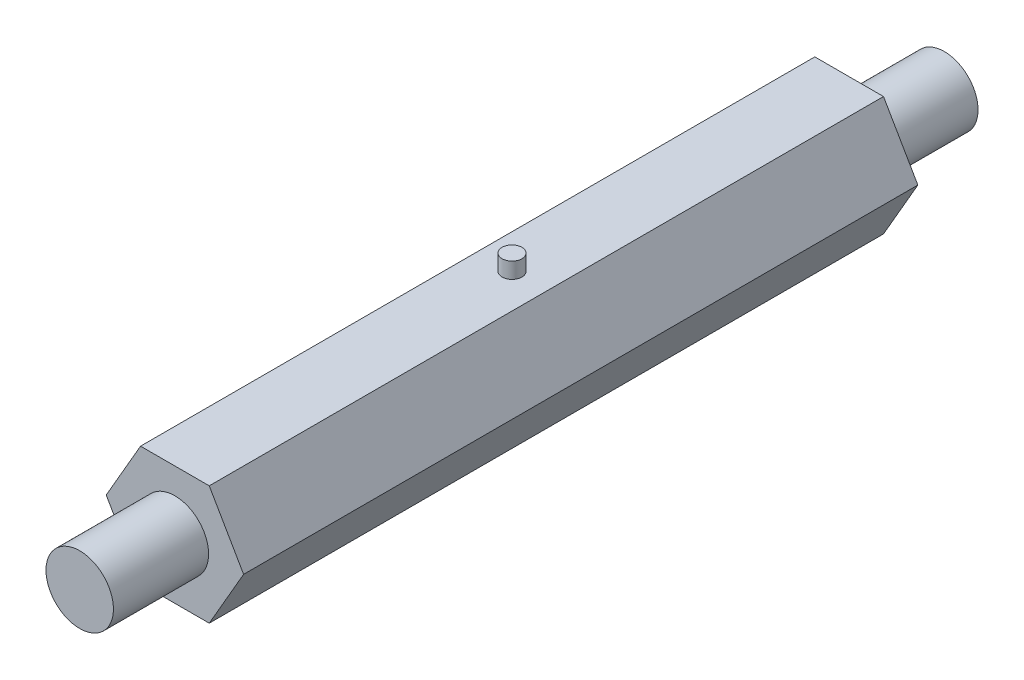
ISO-10303-21;
HEADER;
FILE_DESCRIPTION(('STEP AP214'),'2;1');
FILE_NAME('part.step','',(''),(''),'','','');
FILE_SCHEMA(('AUTOMOTIVE_DESIGN { 1 0 10303 214 1 1 1 1 }'));
ENDSEC;
DATA;
#1=APPLICATION_CONTEXT('core data for automotive mechanical design processes');
#2=APPLICATION_PROTOCOL_DEFINITION('international standard','automotive_design',2000,#1);
#3=PRODUCT_CONTEXT('',#1,'mechanical');
#4=PRODUCT('Part','Part','',(#3));
#5=PRODUCT_RELATED_PRODUCT_CATEGORY('part','',(#4));
#6=PRODUCT_DEFINITION_FORMATION('','',#4);
#7=PRODUCT_DEFINITION_CONTEXT('part definition',#1,'design');
#8=PRODUCT_DEFINITION('design','',#6,#7);
#9=PRODUCT_DEFINITION_SHAPE('','',#8);
#10=(LENGTH_UNIT() NAMED_UNIT(*) SI_UNIT(.MILLI.,.METRE.));
#11=(NAMED_UNIT(*) PLANE_ANGLE_UNIT() SI_UNIT($,.RADIAN.));
#12=(NAMED_UNIT(*) SI_UNIT($,.STERADIAN.) SOLID_ANGLE_UNIT());
#13=UNCERTAINTY_MEASURE_WITH_UNIT(LENGTH_MEASURE(1.E-05),#10,'distance_accuracy_value','');
#14=(GEOMETRIC_REPRESENTATION_CONTEXT(3) GLOBAL_UNCERTAINTY_ASSIGNED_CONTEXT((#13)) GLOBAL_UNIT_ASSIGNED_CONTEXT((#10,
#11,#12)) REPRESENTATION_CONTEXT('',''));
#15=CARTESIAN_POINT('',(0.,0.,0.));
#16=DIRECTION('',(0.,0.,1.));
#17=DIRECTION('',(1.,0.,0.));
#18=AXIS2_PLACEMENT_3D('',#15,#16,#17);
#19=CARTESIAN_POINT('',(10.9985226280624,0.,53.975));
#20=DIRECTION('',(-0.866025403784439,-0.5,0.));
#21=DIRECTION('',(0.5,-0.866025403784439,0.));
#22=AXIS2_PLACEMENT_3D('',#19,#20,#21);
#23=PLANE('',#22);
#24=DIRECTION('',(0.,0.,-1.));
#25=VECTOR('',#24,1.);
#26=CARTESIAN_POINT('',(10.9985226280624,0.,53.975));
#27=LINE('',#26,#25);
#28=CARTESIAN_POINT('',(10.9985226280624,0.,53.975));
#29=VERTEX_POINT('',#28);
#30=CARTESIAN_POINT('',(10.9985226280624,0.,-53.975));
#31=VERTEX_POINT('',#30);
#32=EDGE_CURVE('E114',#29,#31,#27,.T.);
#33=ORIENTED_EDGE('',*,*,#32,.T.);
#34=DIRECTION('',(-0.5,0.866025403784439,0.));
#35=VECTOR('',#34,1.);
#36=CARTESIAN_POINT('',(10.9985226280624,0.,-53.975));
#37=LINE('',#36,#35);
#38=CARTESIAN_POINT('',(5.49926131403118,9.525,-53.975));
#39=VERTEX_POINT('',#38);
#40=EDGE_CURVE('E108',#31,#39,#37,.T.);
#41=ORIENTED_EDGE('',*,*,#40,.T.);
#42=DIRECTION('',(0.,0.,-1.));
#43=VECTOR('',#42,1.);
#44=CARTESIAN_POINT('',(5.49926131403118,9.525,53.975));
#45=LINE('',#44,#43);
#46=CARTESIAN_POINT('',(5.49926131403118,9.525,53.975));
#47=VERTEX_POINT('',#46);
#48=EDGE_CURVE('E92',#47,#39,#45,.T.);
#49=ORIENTED_EDGE('',*,*,#48,.F.);
#50=DIRECTION('',(-0.5,0.866025403784439,0.));
#51=VECTOR('',#50,1.);
#52=CARTESIAN_POINT('',(10.9985226280624,0.,53.975));
#53=LINE('',#52,#51);
#54=EDGE_CURVE('E143',#29,#47,#53,.T.);
#55=ORIENTED_EDGE('',*,*,#54,.F.);
#56=EDGE_LOOP('',(#33,#41,#49,#55));
#57=FACE_BOUND('',#56,.T.);
#58=ADVANCED_FACE('F39',(#57),#23,.F.);
#59=CARTESIAN_POINT('',(5.49926131403118,9.525,53.975));
#60=DIRECTION('',(0.,-1.,0.));
#61=DIRECTION('',(0.,0.,-1.));
#62=AXIS2_PLACEMENT_3D('',#59,#60,#61);
#63=PLANE('',#62);
#64=CARTESIAN_POINT('',(0.,9.525,0.));
#65=DIRECTION('',(0.,-1.,0.));
#66=DIRECTION('',(0.,0.,-1.));
#67=AXIS2_PLACEMENT_3D('',#64,#65,#66);
#68=CIRCLE('',#67,1.5875);
#69=CARTESIAN_POINT('',(0.,9.525,-1.5875));
#70=VERTEX_POINT('',#69);
#71=EDGE_CURVE('E11',#70,#70,#68,.F.);
#72=ORIENTED_EDGE('',*,*,#71,.F.);
#73=EDGE_LOOP('',(#72));
#74=FACE_BOUND('',#73,.T.);
#75=ORIENTED_EDGE('',*,*,#48,.T.);
#76=DIRECTION('',(-1.,0.,0.));
#77=VECTOR('',#76,1.);
#78=CARTESIAN_POINT('',(5.49926131403118,9.525,-53.975));
#79=LINE('',#78,#77);
#80=CARTESIAN_POINT('',(-5.49926131403118,9.525,-53.975));
#81=VERTEX_POINT('',#80);
#82=EDGE_CURVE('E96',#39,#81,#79,.T.);
#83=ORIENTED_EDGE('',*,*,#82,.T.);
#84=DIRECTION('',(0.,0.,-1.));
#85=VECTOR('',#84,1.);
#86=CARTESIAN_POINT('',(-5.49926131403118,9.525,53.975));
#87=LINE('',#86,#85);
#88=CARTESIAN_POINT('',(-5.49926131403118,9.525,53.975));
#89=VERTEX_POINT('',#88);
#90=EDGE_CURVE('E102',#89,#81,#87,.T.);
#91=ORIENTED_EDGE('',*,*,#90,.F.);
#92=DIRECTION('',(-1.,0.,0.));
#93=VECTOR('',#92,1.);
#94=CARTESIAN_POINT('',(5.49926131403118,9.525,53.975));
#95=LINE('',#94,#93);
#96=EDGE_CURVE('E97',#47,#89,#95,.T.);
#97=ORIENTED_EDGE('',*,*,#96,.F.);
#98=EDGE_LOOP('',(#75,#83,#91,#97));
#99=FACE_BOUND('',#98,.T.);
#100=ADVANCED_FACE('F94',(#74,#99),#63,.F.);
#101=CARTESIAN_POINT('',(-5.49926131403118,9.525,53.975));
#102=DIRECTION('',(0.866025403784439,-0.5,0.));
#103=DIRECTION('',(0.5,0.866025403784439,0.));
#104=AXIS2_PLACEMENT_3D('',#101,#102,#103);
#105=PLANE('',#104);
#106=ORIENTED_EDGE('',*,*,#90,.T.);
#107=DIRECTION('',(-0.5,-0.866025403784439,0.));
#108=VECTOR('',#107,1.);
#109=CARTESIAN_POINT('',(-5.49926131403118,9.525,-53.975));
#110=LINE('',#109,#108);
#111=CARTESIAN_POINT('',(-10.9985226280624,0.,-53.975));
#112=VERTEX_POINT('',#111);
#113=EDGE_CURVE('E111',#81,#112,#110,.T.);
#114=ORIENTED_EDGE('',*,*,#113,.T.);
#115=DIRECTION('',(0.,0.,-1.));
#116=VECTOR('',#115,1.);
#117=CARTESIAN_POINT('',(-10.9985226280624,0.,53.975));
#118=LINE('',#117,#116);
#119=CARTESIAN_POINT('',(-10.9985226280624,0.,53.975));
#120=VERTEX_POINT('',#119);
#121=EDGE_CURVE('E169',#120,#112,#118,.T.);
#122=ORIENTED_EDGE('',*,*,#121,.F.);
#123=DIRECTION('',(-0.5,-0.866025403784439,0.));
#124=VECTOR('',#123,1.);
#125=CARTESIAN_POINT('',(-5.49926131403118,9.525,53.975));
#126=LINE('',#125,#124);
#127=EDGE_CURVE('E151',#89,#120,#126,.T.);
#128=ORIENTED_EDGE('',*,*,#127,.F.);
#129=EDGE_LOOP('',(#106,#114,#122,#128));
#130=FACE_BOUND('',#129,.T.);
#131=ADVANCED_FACE('F175',(#130),#105,.F.);
#132=CARTESIAN_POINT('',(-10.9985226280624,0.,53.975));
#133=DIRECTION('',(0.866025403784439,0.5,0.));
#134=DIRECTION('',(-0.5,0.866025403784439,0.));
#135=AXIS2_PLACEMENT_3D('',#132,#133,#134);
#136=PLANE('',#135);
#137=ORIENTED_EDGE('',*,*,#121,.T.);
#138=DIRECTION('',(0.5,-0.866025403784439,0.));
#139=VECTOR('',#138,1.);
#140=CARTESIAN_POINT('',(-10.9985226280624,0.,-53.975));
#141=LINE('',#140,#139);
#142=CARTESIAN_POINT('',(-5.49926131403119,-9.52499999999999,-53.975));
#143=VERTEX_POINT('',#142);
#144=EDGE_CURVE('E128',#112,#143,#141,.T.);
#145=ORIENTED_EDGE('',*,*,#144,.T.);
#146=DIRECTION('',(0.,0.,-1.));
#147=VECTOR('',#146,1.);
#148=CARTESIAN_POINT('',(-5.49926131403119,-9.52499999999999,53.975));
#149=LINE('',#148,#147);
#150=CARTESIAN_POINT('',(-5.49926131403119,-9.52499999999999,53.975));
#151=VERTEX_POINT('',#150);
#152=EDGE_CURVE('E166',#151,#143,#149,.T.);
#153=ORIENTED_EDGE('',*,*,#152,.F.);
#154=DIRECTION('',(0.5,-0.866025403784439,0.));
#155=VECTOR('',#154,1.);
#156=CARTESIAN_POINT('',(-10.9985226280624,0.,53.975));
#157=LINE('',#156,#155);
#158=EDGE_CURVE('E154',#120,#151,#157,.T.);
#159=ORIENTED_EDGE('',*,*,#158,.F.);
#160=EDGE_LOOP('',(#137,#145,#153,#159));
#161=FACE_BOUND('',#160,.T.);
#162=ADVANCED_FACE('F181',(#161),#136,.F.);
#163=CARTESIAN_POINT('',(-5.49926131403119,-9.52499999999999,53.975));
#164=DIRECTION('',(0.,1.,0.));
#165=DIRECTION('',(-1.,0.,0.));
#166=AXIS2_PLACEMENT_3D('',#163,#164,#165);
#167=PLANE('',#166);
#168=ORIENTED_EDGE('',*,*,#152,.T.);
#169=DIRECTION('',(1.,0.,0.));
#170=VECTOR('',#169,1.);
#171=CARTESIAN_POINT('',(-5.49926131403119,-9.52499999999999,-53.975));
#172=LINE('',#171,#170);
#173=CARTESIAN_POINT('',(5.49926131403118,-9.525,-53.975));
#174=VERTEX_POINT('',#173);
#175=EDGE_CURVE('E132',#143,#174,#172,.T.);
#176=ORIENTED_EDGE('',*,*,#175,.T.);
#177=DIRECTION('',(0.,0.,-1.));
#178=VECTOR('',#177,1.);
#179=CARTESIAN_POINT('',(5.49926131403118,-9.525,53.975));
#180=LINE('',#179,#178);
#181=CARTESIAN_POINT('',(5.49926131403118,-9.525,53.975));
#182=VERTEX_POINT('',#181);
#183=EDGE_CURVE('E163',#182,#174,#180,.T.);
#184=ORIENTED_EDGE('',*,*,#183,.F.);
#185=DIRECTION('',(1.,0.,0.));
#186=VECTOR('',#185,1.);
#187=CARTESIAN_POINT('',(-5.49926131403119,-9.52499999999999,53.975));
#188=LINE('',#187,#186);
#189=EDGE_CURVE('E59',#151,#182,#188,.T.);
#190=ORIENTED_EDGE('',*,*,#189,.F.);
#191=EDGE_LOOP('',(#168,#176,#184,#190));
#192=FACE_BOUND('',#191,.T.);
#193=ADVANCED_FACE('F184',(#192),#167,.F.);
#194=CARTESIAN_POINT('',(5.49926131403118,-9.525,53.975));
#195=DIRECTION('',(-0.866025403784438,0.5,0.));
#196=DIRECTION('',(-0.5,-0.866025403784438,0.));
#197=AXIS2_PLACEMENT_3D('',#194,#195,#196);
#198=PLANE('',#197);
#199=ORIENTED_EDGE('',*,*,#183,.T.);
#200=DIRECTION('',(0.5,0.866025403784438,0.));
#201=VECTOR('',#200,1.);
#202=CARTESIAN_POINT('',(5.49926131403118,-9.525,-53.975));
#203=LINE('',#202,#201);
#204=EDGE_CURVE('E136',#174,#31,#203,.T.);
#205=ORIENTED_EDGE('',*,*,#204,.T.);
#206=ORIENTED_EDGE('',*,*,#32,.F.);
#207=DIRECTION('',(0.5,0.866025403784438,0.));
#208=VECTOR('',#207,1.);
#209=CARTESIAN_POINT('',(5.49926131403118,-9.525,53.975));
#210=LINE('',#209,#208);
#211=EDGE_CURVE('E54',#182,#29,#210,.T.);
#212=ORIENTED_EDGE('',*,*,#211,.F.);
#213=EDGE_LOOP('',(#199,#205,#206,#212));
#214=FACE_BOUND('',#213,.T.);
#215=ADVANCED_FACE('F186',(#214),#198,.F.);
#216=CARTESIAN_POINT('',(0.,0.,53.975));
#217=DIRECTION('',(0.,0.,1.));
#218=DIRECTION('',(1.,0.,0.));
#219=AXIS2_PLACEMENT_3D('',#216,#217,#218);
#220=PLANE('',#219);
#221=CARTESIAN_POINT('',(0.,0.,53.975));
#222=DIRECTION('',(0.,0.,1.));
#223=DIRECTION('',(1.,0.,0.));
#224=AXIS2_PLACEMENT_3D('',#221,#222,#223);
#225=CIRCLE('',#224,5.3975);
#226=CARTESIAN_POINT('',(-5.3975,0.,53.975));
#227=VERTEX_POINT('',#226);
#228=EDGE_CURVE('E47',#227,#227,#225,.T.);
#229=ORIENTED_EDGE('',*,*,#228,.F.);
#230=EDGE_LOOP('',(#229));
#231=FACE_BOUND('',#230,.T.);
#232=ORIENTED_EDGE('',*,*,#54,.T.);
#233=ORIENTED_EDGE('',*,*,#96,.T.);
#234=ORIENTED_EDGE('',*,*,#127,.T.);
#235=ORIENTED_EDGE('',*,*,#158,.T.);
#236=ORIENTED_EDGE('',*,*,#189,.T.);
#237=ORIENTED_EDGE('',*,*,#211,.T.);
#238=EDGE_LOOP('',(#232,#233,#234,#235,#236,#237));
#239=FACE_BOUND('',#238,.T.);
#240=ADVANCED_FACE('F178',(#231,#239),#220,.T.);
#241=CARTESIAN_POINT('',(0.,0.,69.215));
#242=DIRECTION('',(0.,0.,-1.));
#243=DIRECTION('',(-1.,0.,0.));
#244=AXIS2_PLACEMENT_3D('',#241,#242,#243);
#245=CYLINDRICAL_SURFACE('',#244,5.3975);
#246=CARTESIAN_POINT('',(0.,0.,69.215));
#247=DIRECTION('',(0.,0.,1.));
#248=DIRECTION('',(1.,0.,0.));
#249=AXIS2_PLACEMENT_3D('',#246,#247,#248);
#250=CIRCLE('',#249,5.3975);
#251=CARTESIAN_POINT('',(-5.3975,0.,69.215));
#252=VERTEX_POINT('',#251);
#253=EDGE_CURVE('E139',#252,#252,#250,.T.);
#254=CARTESIAN_POINT('',(-5.3975,0.,69.215));
#255=CARTESIAN_POINT('',(-5.3975,0.,69.05625));
#256=CARTESIAN_POINT('',(-5.3975,0.,68.8975));
#257=CARTESIAN_POINT('',(-5.3975,0.,68.58));
#258=CARTESIAN_POINT('',(-5.3975,0.,68.42125));
#259=CARTESIAN_POINT('',(-5.3975,0.,68.10375));
#260=CARTESIAN_POINT('',(-5.3975,0.,67.945));
#261=CARTESIAN_POINT('',(-5.3975,0.,67.6275));
#262=CARTESIAN_POINT('',(-5.3975,0.,67.46875));
#263=CARTESIAN_POINT('',(-5.3975,0.,67.15125));
#264=CARTESIAN_POINT('',(-5.3975,0.,66.9925));
#265=CARTESIAN_POINT('',(-5.3975,0.,66.675));
#266=CARTESIAN_POINT('',(-5.3975,0.,66.51625));
#267=CARTESIAN_POINT('',(-5.3975,0.,66.19875));
#268=CARTESIAN_POINT('',(-5.3975,0.,66.04));
#269=CARTESIAN_POINT('',(-5.3975,0.,65.7225));
#270=CARTESIAN_POINT('',(-5.3975,0.,65.56375));
#271=CARTESIAN_POINT('',(-5.3975,0.,65.24625));
#272=CARTESIAN_POINT('',(-5.3975,0.,65.0875));
#273=CARTESIAN_POINT('',(-5.3975,0.,64.77));
#274=CARTESIAN_POINT('',(-5.3975,0.,64.61125));
#275=CARTESIAN_POINT('',(-5.3975,0.,64.29375));
#276=CARTESIAN_POINT('',(-5.3975,0.,64.135));
#277=CARTESIAN_POINT('',(-5.3975,0.,63.8175));
#278=CARTESIAN_POINT('',(-5.3975,0.,63.65875));
#279=CARTESIAN_POINT('',(-5.3975,0.,63.34125));
#280=CARTESIAN_POINT('',(-5.3975,0.,63.1825));
#281=CARTESIAN_POINT('',(-5.3975,0.,62.865));
#282=CARTESIAN_POINT('',(-5.3975,0.,62.70625));
#283=CARTESIAN_POINT('',(-5.3975,0.,62.38875));
#284=CARTESIAN_POINT('',(-5.3975,0.,62.23));
#285=CARTESIAN_POINT('',(-5.3975,0.,61.9125));
#286=CARTESIAN_POINT('',(-5.3975,0.,61.75375));
#287=CARTESIAN_POINT('',(-5.3975,0.,61.43625));
#288=CARTESIAN_POINT('',(-5.3975,0.,61.2775));
#289=CARTESIAN_POINT('',(-5.3975,0.,60.96));
#290=CARTESIAN_POINT('',(-5.3975,0.,60.80125));
#291=CARTESIAN_POINT('',(-5.3975,0.,60.48375));
#292=CARTESIAN_POINT('',(-5.3975,0.,60.325));
#293=CARTESIAN_POINT('',(-5.3975,0.,60.0075));
#294=CARTESIAN_POINT('',(-5.3975,0.,59.84875));
#295=CARTESIAN_POINT('',(-5.3975,0.,59.53125));
#296=CARTESIAN_POINT('',(-5.3975,0.,59.3725));
#297=CARTESIAN_POINT('',(-5.3975,0.,59.055));
#298=CARTESIAN_POINT('',(-5.3975,0.,58.89625));
#299=CARTESIAN_POINT('',(-5.3975,0.,58.57875));
#300=CARTESIAN_POINT('',(-5.3975,0.,58.42));
#301=CARTESIAN_POINT('',(-5.3975,0.,58.1025));
#302=CARTESIAN_POINT('',(-5.3975,0.,57.94375));
#303=CARTESIAN_POINT('',(-5.3975,0.,57.62625));
#304=CARTESIAN_POINT('',(-5.3975,0.,57.4675));
#305=CARTESIAN_POINT('',(-5.3975,0.,57.15));
#306=CARTESIAN_POINT('',(-5.3975,0.,56.99125));
#307=CARTESIAN_POINT('',(-5.3975,0.,56.67375));
#308=CARTESIAN_POINT('',(-5.3975,0.,56.515));
#309=CARTESIAN_POINT('',(-5.3975,0.,56.1975));
#310=CARTESIAN_POINT('',(-5.3975,0.,56.03875));
#311=CARTESIAN_POINT('',(-5.3975,0.,55.72125));
#312=CARTESIAN_POINT('',(-5.3975,0.,55.5625));
#313=CARTESIAN_POINT('',(-5.3975,0.,55.245));
#314=CARTESIAN_POINT('',(-5.3975,0.,55.08625));
#315=CARTESIAN_POINT('',(-5.3975,0.,54.76875));
#316=CARTESIAN_POINT('',(-5.3975,0.,54.61));
#317=CARTESIAN_POINT('',(-5.3975,0.,54.2925));
#318=CARTESIAN_POINT('',(-5.3975,0.,54.13375));
#319=CARTESIAN_POINT('',(-5.3975,0.,53.975));
#320=B_SPLINE_CURVE_WITH_KNOTS('',3,(#254,#255,#256,#257,#258,#259,#260,#261,#262,#263,#264,
#265,#266,#267,#268,#269,#270,#271,#272,#273,#274,#275,#276,#277,#278,#279,#280,#281,#282,#283,
#284,#285,#286,#287,#288,#289,#290,#291,#292,#293,#294,#295,#296,#297,#298,#299,#300,#301,#302,
#303,#304,#305,#306,#307,#308,#309,#310,#311,#312,#313,#314,#315,#316,#317,#318,#319),
.UNSPECIFIED.,.F.,.F.,(4,2,2,2,2,2,2,2,2,2,2,2,2,2,2,2,2,2,2,2,2,2,2,2,2,2,2,2,2,2,2,2,4),(0.,
0.476249999999998,0.952499999999995,1.42874999999999,1.90499999999999,2.38124999999999,2.8575,
3.33375,3.80999999999999,4.28624999999999,4.76249999999999,5.23875,5.715,6.19125,
6.66749999999999,7.14374999999999,7.61999999999999,8.09624999999999,8.5725,9.04874999999999,
9.52499999999999,10.00125,10.4775,10.95375,11.43,11.90625,12.3825,12.85875,13.335,13.81125,
14.2875,14.76375,15.24),.UNSPECIFIED.);
#321=EDGE_CURVE('BSEAM193',#252,#227,#320,.T.);
#322=ORIENTED_EDGE('',*,*,#253,.F.);
#323=ORIENTED_EDGE('',*,*,#228,.T.);
#324=ORIENTED_EDGE('',*,*,#321,.T.);
#325=ORIENTED_EDGE('',*,*,#321,.F.);
#326=EDGE_LOOP('',(#322,#324,#323,#325));
#327=FACE_BOUND('',#326,.T.);
#328=ADVANCED_FACE('F193',(#327),#245,.T.);
#329=CARTESIAN_POINT('',(0.,0.,69.215));
#330=DIRECTION('',(0.,0.,1.));
#331=DIRECTION('',(1.,0.,0.));
#332=AXIS2_PLACEMENT_3D('',#329,#330,#331);
#333=PLANE('',#332);
#334=ORIENTED_EDGE('',*,*,#253,.T.);
#335=EDGE_LOOP('',(#334));
#336=FACE_BOUND('',#335,.T.);
#337=ADVANCED_FACE('F233',(#336),#333,.T.);
#338=CARTESIAN_POINT('',(0.,0.,-53.975));
#339=DIRECTION('',(0.,0.,-1.));
#340=DIRECTION('',(1.,0.,0.));
#341=AXIS2_PLACEMENT_3D('',#338,#339,#340);
#342=PLANE('',#341);
#343=CARTESIAN_POINT('',(0.,0.,-53.975));
#344=DIRECTION('',(0.,0.,1.));
#345=DIRECTION('',(1.,0.,0.));
#346=AXIS2_PLACEMENT_3D('',#343,#344,#345);
#347=CIRCLE('',#346,5.3975);
#348=CARTESIAN_POINT('',(-5.3975,0.,-53.975));
#349=VERTEX_POINT('',#348);
#350=EDGE_CURVE('E124',#349,#349,#347,.T.);
#351=ORIENTED_EDGE('',*,*,#350,.T.);
#352=EDGE_LOOP('',(#351));
#353=FACE_BOUND('',#352,.T.);
#354=ORIENTED_EDGE('',*,*,#40,.F.);
#355=ORIENTED_EDGE('',*,*,#204,.F.);
#356=ORIENTED_EDGE('',*,*,#175,.F.);
#357=ORIENTED_EDGE('',*,*,#144,.F.);
#358=ORIENTED_EDGE('',*,*,#113,.F.);
#359=ORIENTED_EDGE('',*,*,#82,.F.);
#360=EDGE_LOOP('',(#354,#355,#356,#357,#358,#359));
#361=FACE_BOUND('',#360,.T.);
#362=ADVANCED_FACE('F106',(#353,#361),#342,.T.);
#363=CARTESIAN_POINT('',(0.,0.,-69.215));
#364=DIRECTION('',(0.,0.,1.));
#365=DIRECTION('',(-1.,0.,0.));
#366=AXIS2_PLACEMENT_3D('',#363,#364,#365);
#367=CYLINDRICAL_SURFACE('',#366,5.3975);
#368=CARTESIAN_POINT('',(0.,0.,-69.215));
#369=DIRECTION('',(0.,0.,1.));
#370=DIRECTION('',(1.,0.,0.));
#371=AXIS2_PLACEMENT_3D('',#368,#369,#370);
#372=CIRCLE('',#371,5.3975);
#373=CARTESIAN_POINT('',(-5.3975,0.,-69.215));
#374=VERTEX_POINT('',#373);
#375=EDGE_CURVE('E117',#374,#374,#372,.T.);
#376=CARTESIAN_POINT('',(-5.3975,0.,-69.215));
#377=CARTESIAN_POINT('',(-5.3975,0.,-69.05625));
#378=CARTESIAN_POINT('',(-5.3975,0.,-68.8975));
#379=CARTESIAN_POINT('',(-5.3975,0.,-68.58));
#380=CARTESIAN_POINT('',(-5.3975,0.,-68.42125));
#381=CARTESIAN_POINT('',(-5.3975,0.,-68.10375));
#382=CARTESIAN_POINT('',(-5.3975,0.,-67.945));
#383=CARTESIAN_POINT('',(-5.3975,0.,-67.6275));
#384=CARTESIAN_POINT('',(-5.3975,0.,-67.46875));
#385=CARTESIAN_POINT('',(-5.3975,0.,-67.15125));
#386=CARTESIAN_POINT('',(-5.3975,0.,-66.9925));
#387=CARTESIAN_POINT('',(-5.3975,0.,-66.675));
#388=CARTESIAN_POINT('',(-5.3975,0.,-66.51625));
#389=CARTESIAN_POINT('',(-5.3975,0.,-66.19875));
#390=CARTESIAN_POINT('',(-5.3975,0.,-66.04));
#391=CARTESIAN_POINT('',(-5.3975,0.,-65.7225));
#392=CARTESIAN_POINT('',(-5.3975,0.,-65.56375));
#393=CARTESIAN_POINT('',(-5.3975,0.,-65.24625));
#394=CARTESIAN_POINT('',(-5.3975,0.,-65.0875));
#395=CARTESIAN_POINT('',(-5.3975,0.,-64.77));
#396=CARTESIAN_POINT('',(-5.3975,0.,-64.61125));
#397=CARTESIAN_POINT('',(-5.3975,0.,-64.29375));
#398=CARTESIAN_POINT('',(-5.3975,0.,-64.135));
#399=CARTESIAN_POINT('',(-5.3975,0.,-63.8175));
#400=CARTESIAN_POINT('',(-5.3975,0.,-63.65875));
#401=CARTESIAN_POINT('',(-5.3975,0.,-63.34125));
#402=CARTESIAN_POINT('',(-5.3975,0.,-63.1825));
#403=CARTESIAN_POINT('',(-5.3975,0.,-62.865));
#404=CARTESIAN_POINT('',(-5.3975,0.,-62.70625));
#405=CARTESIAN_POINT('',(-5.3975,0.,-62.38875));
#406=CARTESIAN_POINT('',(-5.3975,0.,-62.23));
#407=CARTESIAN_POINT('',(-5.3975,0.,-61.9125));
#408=CARTESIAN_POINT('',(-5.3975,0.,-61.75375));
#409=CARTESIAN_POINT('',(-5.3975,0.,-61.43625));
#410=CARTESIAN_POINT('',(-5.3975,0.,-61.2775));
#411=CARTESIAN_POINT('',(-5.3975,0.,-60.96));
#412=CARTESIAN_POINT('',(-5.3975,0.,-60.80125));
#413=CARTESIAN_POINT('',(-5.3975,0.,-60.48375));
#414=CARTESIAN_POINT('',(-5.3975,0.,-60.325));
#415=CARTESIAN_POINT('',(-5.3975,0.,-60.0075));
#416=CARTESIAN_POINT('',(-5.3975,0.,-59.84875));
#417=CARTESIAN_POINT('',(-5.3975,0.,-59.53125));
#418=CARTESIAN_POINT('',(-5.3975,0.,-59.3725));
#419=CARTESIAN_POINT('',(-5.3975,0.,-59.055));
#420=CARTESIAN_POINT('',(-5.3975,0.,-58.89625));
#421=CARTESIAN_POINT('',(-5.3975,0.,-58.57875));
#422=CARTESIAN_POINT('',(-5.3975,0.,-58.42));
#423=CARTESIAN_POINT('',(-5.3975,0.,-58.1025));
#424=CARTESIAN_POINT('',(-5.3975,0.,-57.94375));
#425=CARTESIAN_POINT('',(-5.3975,0.,-57.62625));
#426=CARTESIAN_POINT('',(-5.3975,0.,-57.4675));
#427=CARTESIAN_POINT('',(-5.3975,0.,-57.15));
#428=CARTESIAN_POINT('',(-5.3975,0.,-56.99125));
#429=CARTESIAN_POINT('',(-5.3975,0.,-56.67375));
#430=CARTESIAN_POINT('',(-5.3975,0.,-56.515));
#431=CARTESIAN_POINT('',(-5.3975,0.,-56.1975));
#432=CARTESIAN_POINT('',(-5.3975,0.,-56.03875));
#433=CARTESIAN_POINT('',(-5.3975,0.,-55.72125));
#434=CARTESIAN_POINT('',(-5.3975,0.,-55.5625));
#435=CARTESIAN_POINT('',(-5.3975,0.,-55.245));
#436=CARTESIAN_POINT('',(-5.3975,0.,-55.08625));
#437=CARTESIAN_POINT('',(-5.3975,0.,-54.76875));
#438=CARTESIAN_POINT('',(-5.3975,0.,-54.61));
#439=CARTESIAN_POINT('',(-5.3975,0.,-54.2925));
#440=CARTESIAN_POINT('',(-5.3975,0.,-54.13375));
#441=CARTESIAN_POINT('',(-5.3975,0.,-53.975));
#442=B_SPLINE_CURVE_WITH_KNOTS('',3,(#376,#377,#378,#379,#380,#381,#382,#383,#384,#385,#386,
#387,#388,#389,#390,#391,#392,#393,#394,#395,#396,#397,#398,#399,#400,#401,#402,#403,#404,#405,
#406,#407,#408,#409,#410,#411,#412,#413,#414,#415,#416,#417,#418,#419,#420,#421,#422,#423,#424,
#425,#426,#427,#428,#429,#430,#431,#432,#433,#434,#435,#436,#437,#438,#439,#440,#441),
.UNSPECIFIED.,.F.,.F.,(4,2,2,2,2,2,2,2,2,2,2,2,2,2,2,2,2,2,2,2,2,2,2,2,2,2,2,2,2,2,2,2,4),(0.,
0.476250000000011,0.952500000000009,1.42875000000001,1.905,2.38125,2.85750000000001,
3.33375000000001,3.81000000000001,4.28625000000001,4.7625,5.23875000000001,5.71500000000001,
6.19125000000001,6.66750000000001,7.14375000000001,7.62000000000001,8.09625000000001,
8.57250000000001,9.04875000000001,9.52500000000001,10.00125,10.4775,10.95375,11.43,11.90625,
12.3825,12.85875,13.335,13.81125,14.2875,14.76375,15.24),.UNSPECIFIED.);
#443=EDGE_CURVE('BSEAM232',#374,#349,#442,.T.);
#444=ORIENTED_EDGE('',*,*,#375,.T.);
#445=ORIENTED_EDGE('',*,*,#350,.F.);
#446=ORIENTED_EDGE('',*,*,#443,.T.);
#447=ORIENTED_EDGE('',*,*,#443,.F.);
#448=EDGE_LOOP('',(#444,#446,#445,#447));
#449=FACE_BOUND('',#448,.T.);
#450=ADVANCED_FACE('F232',(#449),#367,.T.);
#451=CARTESIAN_POINT('',(0.,0.,-69.215));
#452=DIRECTION('',(0.,0.,-1.));
#453=DIRECTION('',(1.,0.,0.));
#454=AXIS2_PLACEMENT_3D('',#451,#452,#453);
#455=PLANE('',#454);
#456=ORIENTED_EDGE('',*,*,#375,.F.);
#457=EDGE_LOOP('',(#456));
#458=FACE_BOUND('',#457,.T.);
#459=ADVANCED_FACE('F244',(#458),#455,.T.);
#460=CARTESIAN_POINT('',(0.,12.065,0.));
#461=DIRECTION('',(0.,-1.,0.));
#462=DIRECTION('',(0.,0.,-1.));
#463=AXIS2_PLACEMENT_3D('',#460,#461,#462);
#464=CYLINDRICAL_SURFACE('',#463,1.5875);
#465=CARTESIAN_POINT('',(0.,12.065,0.));
#466=DIRECTION('',(0.,1.,0.));
#467=DIRECTION('',(0.,0.,1.));
#468=AXIS2_PLACEMENT_3D('',#465,#466,#467);
#469=CIRCLE('',#468,1.5875);
#470=CARTESIAN_POINT('',(0.,12.065,1.5875));
#471=VERTEX_POINT('',#470);
#472=EDGE_CURVE('E121',#471,#471,#469,.T.);
#473=ORIENTED_EDGE('',*,*,#472,.F.);
#474=EDGE_LOOP('',(#473));
#475=FACE_BOUND('',#474,.T.);
#476=ORIENTED_EDGE('',*,*,#71,.T.);
#477=EDGE_LOOP('',(#476));
#478=FACE_BOUND('',#477,.T.);
#479=ADVANCED_FACE('F253',(#475,#478),#464,.T.);
#480=CARTESIAN_POINT('',(0.,12.065,0.));
#481=DIRECTION('',(0.,1.,0.));
#482=DIRECTION('',(0.,0.,1.));
#483=AXIS2_PLACEMENT_3D('',#480,#481,#482);
#484=PLANE('',#483);
#485=ORIENTED_EDGE('',*,*,#472,.T.);
#486=EDGE_LOOP('',(#485));
#487=FACE_BOUND('',#486,.T.);
#488=ADVANCED_FACE('F271',(#487),#484,.T.);
#489=CLOSED_SHELL('',(#58,#100,#131,#162,#193,#215,#240,#328,#337,#362,#450,#459,#479,#488));
#490=MANIFOLD_SOLID_BREP('B2',#489);
#491=ADVANCED_BREP_SHAPE_REPRESENTATION('',(#18,#490),#14);
#492=SHAPE_DEFINITION_REPRESENTATION(#9,#491);
ENDSEC;
END-ISO-10303-21;
